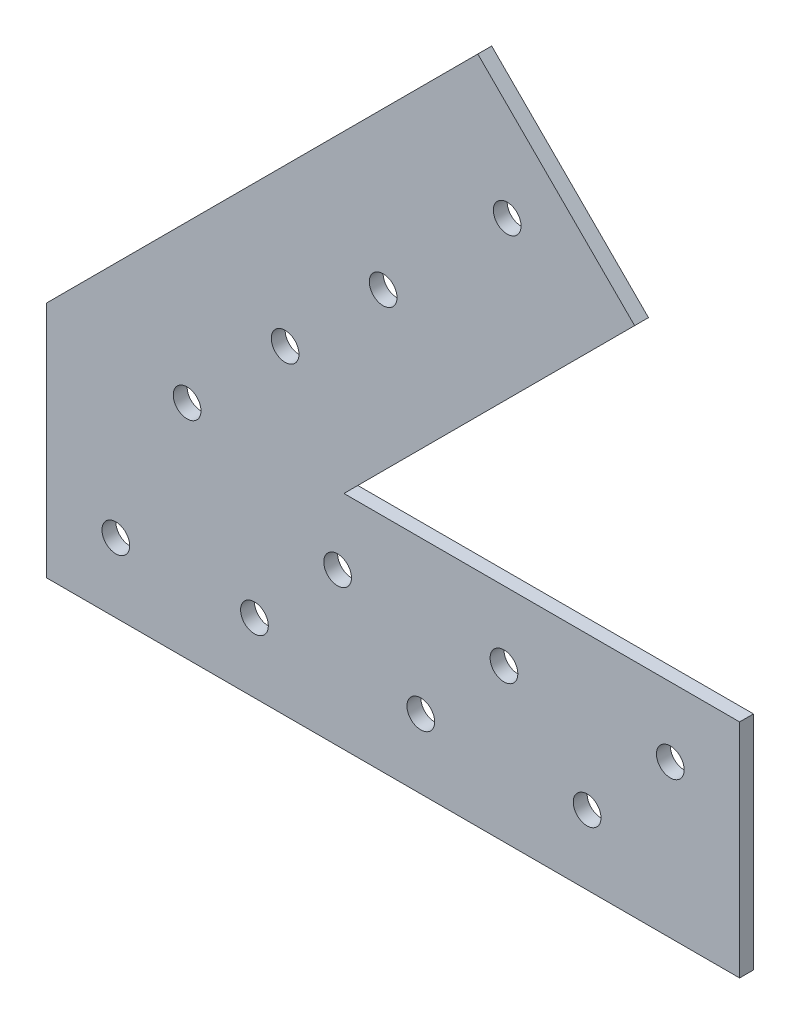
ISO-10303-21;
HEADER;
FILE_DESCRIPTION(('STEP AP214'),'2;1');
FILE_NAME('part.step','',(''),(''),'','','');
FILE_SCHEMA(('AUTOMOTIVE_DESIGN { 1 0 10303 214 1 1 1 1 }'));
ENDSEC;
DATA;
#1=APPLICATION_CONTEXT('core data for automotive mechanical design processes');
#2=APPLICATION_PROTOCOL_DEFINITION('international standard','automotive_design',2000,#1);
#3=PRODUCT_CONTEXT('',#1,'mechanical');
#4=PRODUCT('Part','Part','',(#3));
#5=PRODUCT_RELATED_PRODUCT_CATEGORY('part','',(#4));
#6=PRODUCT_DEFINITION_FORMATION('','',#4);
#7=PRODUCT_DEFINITION_CONTEXT('part definition',#1,'design');
#8=PRODUCT_DEFINITION('design','',#6,#7);
#9=PRODUCT_DEFINITION_SHAPE('','',#8);
#10=(LENGTH_UNIT() NAMED_UNIT(*) SI_UNIT(.MILLI.,.METRE.));
#11=(NAMED_UNIT(*) PLANE_ANGLE_UNIT() SI_UNIT($,.RADIAN.));
#12=(NAMED_UNIT(*) SI_UNIT($,.STERADIAN.) SOLID_ANGLE_UNIT());
#13=UNCERTAINTY_MEASURE_WITH_UNIT(LENGTH_MEASURE(1.E-05),#10,'distance_accuracy_value','');
#14=(GEOMETRIC_REPRESENTATION_CONTEXT(3) GLOBAL_UNCERTAINTY_ASSIGNED_CONTEXT((#13)) GLOBAL_UNIT_ASSIGNED_CONTEXT((#10,
#11,#12)) REPRESENTATION_CONTEXT('',''));
#15=CARTESIAN_POINT('',(0.,0.,0.));
#16=DIRECTION('',(0.,0.,1.));
#17=DIRECTION('',(1.,0.,0.));
#18=AXIS2_PLACEMENT_3D('',#15,#16,#17);
#19=CARTESIAN_POINT('',(260.,10.,5.));
#20=DIRECTION('',(0.,1.,0.));
#21=DIRECTION('',(-1.,0.,0.));
#22=AXIS2_PLACEMENT_3D('',#19,#20,#21);
#23=PLANE('',#22);
#24=DIRECTION('',(1.,0.,0.));
#25=VECTOR('',#24,1.);
#26=CARTESIAN_POINT('',(260.,10.,0.));
#27=LINE('',#26,#25);
#28=CARTESIAN_POINT('',(10.,10.,0.));
#29=VERTEX_POINT('',#28);
#30=CARTESIAN_POINT('',(260.,10.,0.));
#31=VERTEX_POINT('',#30);
#32=EDGE_CURVE('E128',#29,#31,#27,.T.);
#33=ORIENTED_EDGE('',*,*,#32,.T.);
#34=DIRECTION('',(0.,0.,-1.));
#35=VECTOR('',#34,1.);
#36=CARTESIAN_POINT('',(260.,10.,5.));
#37=LINE('',#36,#35);
#38=CARTESIAN_POINT('',(260.,10.,5.));
#39=VERTEX_POINT('',#38);
#40=EDGE_CURVE('E11',#39,#31,#37,.T.);
#41=ORIENTED_EDGE('',*,*,#40,.F.);
#42=DIRECTION('',(1.,0.,0.));
#43=VECTOR('',#42,1.);
#44=CARTESIAN_POINT('',(260.,10.,5.));
#45=LINE('',#44,#43);
#46=CARTESIAN_POINT('',(10.,10.,5.));
#47=VERTEX_POINT('',#46);
#48=EDGE_CURVE('E141',#47,#39,#45,.T.);
#49=ORIENTED_EDGE('',*,*,#48,.F.);
#50=DIRECTION('',(0.,0.,-1.));
#51=VECTOR('',#50,1.);
#52=CARTESIAN_POINT('',(10.,10.,5.));
#53=LINE('',#52,#51);
#54=EDGE_CURVE('E124',#47,#29,#53,.T.);
#55=ORIENTED_EDGE('',*,*,#54,.T.);
#56=EDGE_LOOP('',(#33,#41,#49,#55));
#57=FACE_BOUND('',#56,.T.);
#58=ADVANCED_FACE('F38',(#57),#23,.F.);
#59=CARTESIAN_POINT('',(260.,90.,5.));
#60=DIRECTION('',(-1.,0.,0.));
#61=DIRECTION('',(0.,0.,1.));
#62=AXIS2_PLACEMENT_3D('',#59,#60,#61);
#63=PLANE('',#62);
#64=DIRECTION('',(0.,1.,0.));
#65=VECTOR('',#64,1.);
#66=CARTESIAN_POINT('',(260.,90.,0.));
#67=LINE('',#66,#65);
#68=CARTESIAN_POINT('',(260.,90.,0.));
#69=VERTEX_POINT('',#68);
#70=EDGE_CURVE('E131',#31,#69,#67,.T.);
#71=ORIENTED_EDGE('',*,*,#70,.T.);
#72=DIRECTION('',(0.,0.,-1.));
#73=VECTOR('',#72,1.);
#74=CARTESIAN_POINT('',(260.,90.,5.));
#75=LINE('',#74,#73);
#76=CARTESIAN_POINT('',(260.,90.,5.));
#77=VERTEX_POINT('',#76);
#78=EDGE_CURVE('E46',#77,#69,#75,.T.);
#79=ORIENTED_EDGE('',*,*,#78,.F.);
#80=DIRECTION('',(0.,1.,0.));
#81=VECTOR('',#80,1.);
#82=CARTESIAN_POINT('',(260.,90.,5.));
#83=LINE('',#82,#81);
#84=EDGE_CURVE('E94',#39,#77,#83,.T.);
#85=ORIENTED_EDGE('',*,*,#84,.F.);
#86=ORIENTED_EDGE('',*,*,#40,.T.);
#87=EDGE_LOOP('',(#71,#79,#85,#86));
#88=FACE_BOUND('',#87,.T.);
#89=ADVANCED_FACE('F279',(#88),#63,.F.);
#90=CARTESIAN_POINT('',(117.28,90.,5.));
#91=DIRECTION('',(0.,-1.,0.));
#92=DIRECTION('',(0.,0.,-1.));
#93=AXIS2_PLACEMENT_3D('',#90,#91,#92);
#94=PLANE('',#93);
#95=DIRECTION('',(-1.,0.,0.));
#96=VECTOR('',#95,1.);
#97=CARTESIAN_POINT('',(117.28,90.,0.));
#98=LINE('',#97,#96);
#99=CARTESIAN_POINT('',(117.28,90.,0.));
#100=VERTEX_POINT('',#99);
#101=EDGE_CURVE('E134',#69,#100,#98,.T.);
#102=ORIENTED_EDGE('',*,*,#101,.T.);
#103=DIRECTION('',(0.,0.,-1.));
#104=VECTOR('',#103,1.);
#105=CARTESIAN_POINT('',(117.28,90.,5.));
#106=LINE('',#105,#104);
#107=CARTESIAN_POINT('',(117.28,90.,5.));
#108=VERTEX_POINT('',#107);
#109=EDGE_CURVE('E145',#108,#100,#106,.T.);
#110=ORIENTED_EDGE('',*,*,#109,.F.);
#111=DIRECTION('',(-1.,0.,0.));
#112=VECTOR('',#111,1.);
#113=CARTESIAN_POINT('',(117.28,90.,5.));
#114=LINE('',#113,#112);
#115=EDGE_CURVE('E153',#77,#108,#114,.T.);
#116=ORIENTED_EDGE('',*,*,#115,.F.);
#117=ORIENTED_EDGE('',*,*,#78,.T.);
#118=EDGE_LOOP('',(#102,#110,#116,#117));
#119=FACE_BOUND('',#118,.T.);
#120=ADVANCED_FACE('F151',(#119),#94,.F.);
#121=CARTESIAN_POINT('',(222.132034355965,194.852034355964,5.));
#122=DIRECTION('',(-0.707106781186544,0.707106781186551,0.));
#123=DIRECTION('',(-0.707106781186551,-0.707106781186544,0.));
#124=AXIS2_PLACEMENT_3D('',#121,#122,#123);
#125=PLANE('',#124);
#126=DIRECTION('',(0.707106781186551,0.707106781186544,0.));
#127=VECTOR('',#126,1.);
#128=CARTESIAN_POINT('',(222.132034355965,194.852034355964,0.));
#129=LINE('',#128,#127);
#130=CARTESIAN_POINT('',(222.132034355965,194.852034355964,0.));
#131=VERTEX_POINT('',#130);
#132=EDGE_CURVE('E136',#100,#131,#129,.T.);
#133=ORIENTED_EDGE('',*,*,#132,.T.);
#134=DIRECTION('',(0.,0.,-1.));
#135=VECTOR('',#134,1.);
#136=CARTESIAN_POINT('',(222.132034355965,194.852034355964,5.));
#137=LINE('',#136,#135);
#138=CARTESIAN_POINT('',(222.132034355965,194.852034355964,5.));
#139=VERTEX_POINT('',#138);
#140=EDGE_CURVE('E119',#139,#131,#137,.T.);
#141=ORIENTED_EDGE('',*,*,#140,.F.);
#142=DIRECTION('',(0.707106781186551,0.707106781186544,0.));
#143=VECTOR('',#142,1.);
#144=CARTESIAN_POINT('',(222.132034355965,194.852034355964,5.));
#145=LINE('',#144,#143);
#146=EDGE_CURVE('E110',#108,#139,#145,.T.);
#147=ORIENTED_EDGE('',*,*,#146,.F.);
#148=ORIENTED_EDGE('',*,*,#109,.T.);
#149=EDGE_LOOP('',(#133,#141,#147,#148));
#150=FACE_BOUND('',#149,.T.);
#151=ADVANCED_FACE('F159',(#150),#125,.F.);
#152=CARTESIAN_POINT('',(165.563491861042,251.420576850888,5.));
#153=DIRECTION('',(-0.707106781186551,-0.707106781186544,0.));
#154=DIRECTION('',(0.707106781186544,-0.707106781186551,0.));
#155=AXIS2_PLACEMENT_3D('',#152,#153,#154);
#156=PLANE('',#155);
#157=DIRECTION('',(-0.707106781186544,0.707106781186551,0.));
#158=VECTOR('',#157,1.);
#159=CARTESIAN_POINT('',(165.563491861042,251.420576850888,0.));
#160=LINE('',#159,#158);
#161=CARTESIAN_POINT('',(165.563491861042,251.420576850888,0.));
#162=VERTEX_POINT('',#161);
#163=EDGE_CURVE('E118',#131,#162,#160,.T.);
#164=ORIENTED_EDGE('',*,*,#163,.T.);
#165=DIRECTION('',(0.,0.,-1.));
#166=VECTOR('',#165,1.);
#167=CARTESIAN_POINT('',(165.563491861042,251.420576850888,5.));
#168=LINE('',#167,#166);
#169=CARTESIAN_POINT('',(165.563491861042,251.420576850888,5.));
#170=VERTEX_POINT('',#169);
#171=EDGE_CURVE('E115',#170,#162,#168,.T.);
#172=ORIENTED_EDGE('',*,*,#171,.F.);
#173=DIRECTION('',(-0.707106781186544,0.707106781186551,0.));
#174=VECTOR('',#173,1.);
#175=CARTESIAN_POINT('',(165.563491861042,251.420576850888,5.));
#176=LINE('',#175,#174);
#177=EDGE_CURVE('E104',#139,#170,#176,.T.);
#178=ORIENTED_EDGE('',*,*,#177,.F.);
#179=ORIENTED_EDGE('',*,*,#140,.T.);
#180=EDGE_LOOP('',(#164,#172,#178,#179));
#181=FACE_BOUND('',#180,.T.);
#182=ADVANCED_FACE('F116',(#181),#156,.F.);
#183=CARTESIAN_POINT('',(10.0000000000014,95.8570849898473,5.));
#184=DIRECTION('',(0.707106781186549,-0.707106781186546,0.));
#185=DIRECTION('',(0.707106781186546,0.707106781186549,0.));
#186=AXIS2_PLACEMENT_3D('',#183,#184,#185);
#187=PLANE('',#186);
#188=DIRECTION('',(-0.707106781186546,-0.707106781186549,0.));
#189=VECTOR('',#188,1.);
#190=CARTESIAN_POINT('',(10.0000000000014,95.8570849898473,0.));
#191=LINE('',#190,#189);
#192=CARTESIAN_POINT('',(10.0000000000014,95.8570849898473,0.));
#193=VERTEX_POINT('',#192);
#194=EDGE_CURVE('E80',#162,#193,#191,.T.);
#195=ORIENTED_EDGE('',*,*,#194,.T.);
#196=DIRECTION('',(0.,0.,-1.));
#197=VECTOR('',#196,1.);
#198=CARTESIAN_POINT('',(10.0000000000014,95.8570849898473,5.));
#199=LINE('',#198,#197);
#200=CARTESIAN_POINT('',(10.0000000000014,95.8570849898473,5.));
#201=VERTEX_POINT('',#200);
#202=EDGE_CURVE('E120',#201,#193,#199,.T.);
#203=ORIENTED_EDGE('',*,*,#202,.F.);
#204=DIRECTION('',(-0.707106781186546,-0.707106781186549,0.));
#205=VECTOR('',#204,1.);
#206=CARTESIAN_POINT('',(10.0000000000014,95.8570849898473,5.));
#207=LINE('',#206,#205);
#208=EDGE_CURVE('E108',#170,#201,#207,.T.);
#209=ORIENTED_EDGE('',*,*,#208,.F.);
#210=ORIENTED_EDGE('',*,*,#171,.T.);
#211=EDGE_LOOP('',(#195,#203,#209,#210));
#212=FACE_BOUND('',#211,.T.);
#213=ADVANCED_FACE('F122',(#212),#187,.F.);
#214=CARTESIAN_POINT('',(10.,10.,5.));
#215=DIRECTION('',(1.,0.,0.));
#216=DIRECTION('',(0.,1.,0.));
#217=AXIS2_PLACEMENT_3D('',#214,#215,#216);
#218=PLANE('',#217);
#219=DIRECTION('',(0.,-1.,0.));
#220=VECTOR('',#219,1.);
#221=CARTESIAN_POINT('',(10.,10.,0.));
#222=LINE('',#221,#220);
#223=EDGE_CURVE('E86',#193,#29,#222,.T.);
#224=ORIENTED_EDGE('',*,*,#223,.T.);
#225=ORIENTED_EDGE('',*,*,#54,.F.);
#226=DIRECTION('',(0.,-1.,0.));
#227=VECTOR('',#226,1.);
#228=CARTESIAN_POINT('',(10.,10.,5.));
#229=LINE('',#228,#227);
#230=EDGE_CURVE('E54',#201,#47,#229,.T.);
#231=ORIENTED_EDGE('',*,*,#230,.F.);
#232=ORIENTED_EDGE('',*,*,#202,.T.);
#233=EDGE_LOOP('',(#224,#225,#231,#232));
#234=FACE_BOUND('',#233,.T.);
#235=ADVANCED_FACE('F241',(#234),#218,.F.);
#236=CARTESIAN_POINT('',(0.,0.,5.));
#237=DIRECTION('',(0.,0.,-1.));
#238=DIRECTION('',(-1.,0.,0.));
#239=AXIS2_PLACEMENT_3D('',#236,#237,#238);
#240=PLANE('',#239);
#241=CARTESIAN_POINT('',(85.0000000000014,35.,5.));
#242=DIRECTION('',(0.,0.,1.));
#243=DIRECTION('',(1.,0.,0.));
#244=AXIS2_PLACEMENT_3D('',#241,#242,#243);
#245=CIRCLE('',#244,5.);
#246=CARTESIAN_POINT('',(90.0000000000014,35.,5.));
#247=VERTEX_POINT('',#246);
#248=EDGE_CURVE('E224',#247,#247,#245,.T.);
#249=ORIENTED_EDGE('',*,*,#248,.F.);
#250=EDGE_LOOP('',(#249));
#251=FACE_BOUND('',#250,.T.);
#252=CARTESIAN_POINT('',(115.000000000001,65.,5.));
#253=DIRECTION('',(0.,0.,1.));
#254=DIRECTION('',(1.,0.,0.));
#255=AXIS2_PLACEMENT_3D('',#252,#253,#254);
#256=CIRCLE('',#255,5.);
#257=CARTESIAN_POINT('',(120.000000000001,65.,5.));
#258=VERTEX_POINT('',#257);
#259=EDGE_CURVE('E218',#258,#258,#256,.T.);
#260=ORIENTED_EDGE('',*,*,#259,.F.);
#261=EDGE_LOOP('',(#260));
#262=FACE_BOUND('',#261,.T.);
#263=CARTESIAN_POINT('',(145.000000000001,35.,5.));
#264=DIRECTION('',(0.,0.,1.));
#265=DIRECTION('',(1.,0.,0.));
#266=AXIS2_PLACEMENT_3D('',#263,#264,#265);
#267=CIRCLE('',#266,5.);
#268=CARTESIAN_POINT('',(150.000000000001,35.,5.));
#269=VERTEX_POINT('',#268);
#270=EDGE_CURVE('E212',#269,#269,#267,.T.);
#271=ORIENTED_EDGE('',*,*,#270,.F.);
#272=EDGE_LOOP('',(#271));
#273=FACE_BOUND('',#272,.T.);
#274=CARTESIAN_POINT('',(175.000000000001,65.,5.));
#275=DIRECTION('',(0.,0.,1.));
#276=DIRECTION('',(1.,0.,0.));
#277=AXIS2_PLACEMENT_3D('',#274,#275,#276);
#278=CIRCLE('',#277,5.);
#279=CARTESIAN_POINT('',(180.000000000001,65.,5.));
#280=VERTEX_POINT('',#279);
#281=EDGE_CURVE('E206',#280,#280,#278,.T.);
#282=ORIENTED_EDGE('',*,*,#281,.F.);
#283=EDGE_LOOP('',(#282));
#284=FACE_BOUND('',#283,.T.);
#285=CARTESIAN_POINT('',(205.000000000001,35.,5.));
#286=DIRECTION('',(0.,0.,1.));
#287=DIRECTION('',(1.,0.,0.));
#288=AXIS2_PLACEMENT_3D('',#285,#286,#287);
#289=CIRCLE('',#288,5.);
#290=CARTESIAN_POINT('',(210.000000000001,35.,5.));
#291=VERTEX_POINT('',#290);
#292=EDGE_CURVE('E200',#291,#291,#289,.T.);
#293=ORIENTED_EDGE('',*,*,#292,.F.);
#294=EDGE_LOOP('',(#293));
#295=FACE_BOUND('',#294,.T.);
#296=CARTESIAN_POINT('',(235.000000000001,65.,5.));
#297=DIRECTION('',(0.,0.,1.));
#298=DIRECTION('',(1.,0.,0.));
#299=AXIS2_PLACEMENT_3D('',#296,#297,#298);
#300=CIRCLE('',#299,5.);
#301=CARTESIAN_POINT('',(240.000000000001,65.,5.));
#302=VERTEX_POINT('',#301);
#303=EDGE_CURVE('E194',#302,#302,#300,.T.);
#304=ORIENTED_EDGE('',*,*,#303,.F.);
#305=EDGE_LOOP('',(#304));
#306=FACE_BOUND('',#305,.T.);
#307=CARTESIAN_POINT('',(96.0661233356786,125.355235982676,5.));
#308=DIRECTION('',(0.,0.,1.));
#309=DIRECTION('',(1.,0.,0.));
#310=AXIS2_PLACEMENT_3D('',#307,#308,#309);
#311=CIRCLE('',#310,5.00000000000001);
#312=CARTESIAN_POINT('',(101.066123335679,125.355235982676,5.));
#313=VERTEX_POINT('',#312);
#314=EDGE_CURVE('E189',#313,#313,#311,.T.);
#315=ORIENTED_EDGE('',*,*,#314,.F.);
#316=EDGE_LOOP('',(#315));
#317=FACE_BOUND('',#316,.T.);
#318=CARTESIAN_POINT('',(131.421565471357,160.710471965351,5.));
#319=DIRECTION('',(0.,0.,1.));
#320=DIRECTION('',(1.,0.,0.));
#321=AXIS2_PLACEMENT_3D('',#318,#319,#320);
#322=CIRCLE('',#321,5.00000000000001);
#323=CARTESIAN_POINT('',(136.421565471357,160.710471965351,5.));
#324=VERTEX_POINT('',#323);
#325=EDGE_CURVE('E183',#324,#324,#322,.T.);
#326=ORIENTED_EDGE('',*,*,#325,.F.);
#327=EDGE_LOOP('',(#326));
#328=FACE_BOUND('',#327,.T.);
#329=CARTESIAN_POINT('',(176.170042040664,205.458687612088,5.));
#330=DIRECTION('',(0.,0.,1.));
#331=DIRECTION('',(1.,0.,0.));
#332=AXIS2_PLACEMENT_3D('',#329,#330,#331);
#333=CIRCLE('',#332,5.00000000000001);
#334=CARTESIAN_POINT('',(181.170042040664,205.458687612088,5.));
#335=VERTEX_POINT('',#334);
#336=EDGE_CURVE('E176',#335,#335,#333,.T.);
#337=ORIENTED_EDGE('',*,*,#336,.F.);
#338=EDGE_LOOP('',(#337));
#339=FACE_BOUND('',#338,.T.);
#340=CARTESIAN_POINT('',(35.0000000000014,35.,5.));
#341=DIRECTION('',(0.,0.,1.));
#342=DIRECTION('',(1.,0.,0.));
#343=AXIS2_PLACEMENT_3D('',#340,#341,#342);
#344=CIRCLE('',#343,5.);
#345=CARTESIAN_POINT('',(40.0000000000014,35.,5.));
#346=VERTEX_POINT('',#345);
#347=EDGE_CURVE('E170',#346,#346,#344,.T.);
#348=ORIENTED_EDGE('',*,*,#347,.F.);
#349=EDGE_LOOP('',(#348));
#350=FACE_BOUND('',#349,.T.);
#351=CARTESIAN_POINT('',(60.7106812,90.,5.));
#352=DIRECTION('',(0.,0.,1.));
#353=DIRECTION('',(1.,0.,0.));
#354=AXIS2_PLACEMENT_3D('',#351,#352,#353);
#355=CIRCLE('',#354,5.00000000000001);
#356=CARTESIAN_POINT('',(65.7106812,90.,5.));
#357=VERTEX_POINT('',#356);
#358=EDGE_CURVE('E164',#357,#357,#355,.T.);
#359=ORIENTED_EDGE('',*,*,#358,.F.);
#360=EDGE_LOOP('',(#359));
#361=FACE_BOUND('',#360,.T.);
#362=ORIENTED_EDGE('',*,*,#48,.T.);
#363=ORIENTED_EDGE('',*,*,#84,.T.);
#364=ORIENTED_EDGE('',*,*,#115,.T.);
#365=ORIENTED_EDGE('',*,*,#146,.T.);
#366=ORIENTED_EDGE('',*,*,#177,.T.);
#367=ORIENTED_EDGE('',*,*,#208,.T.);
#368=ORIENTED_EDGE('',*,*,#230,.T.);
#369=EDGE_LOOP('',(#362,#363,#364,#365,#366,#367,#368));
#370=FACE_BOUND('',#369,.T.);
#371=ADVANCED_FACE('F106',(#251,#262,#273,#284,#295,#306,#317,#328,#339,#350,#361,#370),#240,.F.);
#372=CARTESIAN_POINT('',(0.,0.,0.));
#373=DIRECTION('',(0.,0.,-1.));
#374=DIRECTION('',(-1.,0.,0.));
#375=AXIS2_PLACEMENT_3D('',#372,#373,#374);
#376=PLANE('',#375);
#377=CARTESIAN_POINT('',(85.0000000000014,35.,0.));
#378=DIRECTION('',(0.,0.,1.));
#379=DIRECTION('',(1.,0.,0.));
#380=AXIS2_PLACEMENT_3D('',#377,#378,#379);
#381=CIRCLE('',#380,5.);
#382=CARTESIAN_POINT('',(90.0000000000014,35.,0.));
#383=VERTEX_POINT('',#382);
#384=EDGE_CURVE('E180',#383,#383,#381,.T.);
#385=ORIENTED_EDGE('',*,*,#384,.T.);
#386=EDGE_LOOP('',(#385));
#387=FACE_BOUND('',#386,.T.);
#388=CARTESIAN_POINT('',(115.000000000001,65.,0.));
#389=DIRECTION('',(0.,0.,1.));
#390=DIRECTION('',(1.,0.,0.));
#391=AXIS2_PLACEMENT_3D('',#388,#389,#390);
#392=CIRCLE('',#391,5.);
#393=CARTESIAN_POINT('',(120.000000000001,65.,0.));
#394=VERTEX_POINT('',#393);
#395=EDGE_CURVE('E221',#394,#394,#392,.T.);
#396=ORIENTED_EDGE('',*,*,#395,.T.);
#397=EDGE_LOOP('',(#396));
#398=FACE_BOUND('',#397,.T.);
#399=CARTESIAN_POINT('',(145.000000000001,35.,0.));
#400=DIRECTION('',(0.,0.,1.));
#401=DIRECTION('',(1.,0.,0.));
#402=AXIS2_PLACEMENT_3D('',#399,#400,#401);
#403=CIRCLE('',#402,5.);
#404=CARTESIAN_POINT('',(150.000000000001,35.,0.));
#405=VERTEX_POINT('',#404);
#406=EDGE_CURVE('E215',#405,#405,#403,.T.);
#407=ORIENTED_EDGE('',*,*,#406,.T.);
#408=EDGE_LOOP('',(#407));
#409=FACE_BOUND('',#408,.T.);
#410=CARTESIAN_POINT('',(175.000000000001,65.,0.));
#411=DIRECTION('',(0.,0.,1.));
#412=DIRECTION('',(1.,0.,0.));
#413=AXIS2_PLACEMENT_3D('',#410,#411,#412);
#414=CIRCLE('',#413,5.);
#415=CARTESIAN_POINT('',(180.000000000001,65.,0.));
#416=VERTEX_POINT('',#415);
#417=EDGE_CURVE('E209',#416,#416,#414,.T.);
#418=ORIENTED_EDGE('',*,*,#417,.T.);
#419=EDGE_LOOP('',(#418));
#420=FACE_BOUND('',#419,.T.);
#421=CARTESIAN_POINT('',(205.000000000001,35.,0.));
#422=DIRECTION('',(0.,0.,1.));
#423=DIRECTION('',(1.,0.,0.));
#424=AXIS2_PLACEMENT_3D('',#421,#422,#423);
#425=CIRCLE('',#424,5.);
#426=CARTESIAN_POINT('',(210.000000000001,35.,0.));
#427=VERTEX_POINT('',#426);
#428=EDGE_CURVE('E203',#427,#427,#425,.T.);
#429=ORIENTED_EDGE('',*,*,#428,.T.);
#430=EDGE_LOOP('',(#429));
#431=FACE_BOUND('',#430,.T.);
#432=CARTESIAN_POINT('',(235.000000000001,65.,0.));
#433=DIRECTION('',(0.,0.,1.));
#434=DIRECTION('',(1.,0.,0.));
#435=AXIS2_PLACEMENT_3D('',#432,#433,#434);
#436=CIRCLE('',#435,5.);
#437=CARTESIAN_POINT('',(240.000000000001,65.,0.));
#438=VERTEX_POINT('',#437);
#439=EDGE_CURVE('E197',#438,#438,#436,.T.);
#440=ORIENTED_EDGE('',*,*,#439,.T.);
#441=EDGE_LOOP('',(#440));
#442=FACE_BOUND('',#441,.T.);
#443=CARTESIAN_POINT('',(96.0661233356786,125.355235982676,0.));
#444=DIRECTION('',(0.,0.,1.));
#445=DIRECTION('',(1.,0.,0.));
#446=AXIS2_PLACEMENT_3D('',#443,#444,#445);
#447=CIRCLE('',#446,5.00000000000001);
#448=CARTESIAN_POINT('',(101.066123335679,125.355235982676,0.));
#449=VERTEX_POINT('',#448);
#450=EDGE_CURVE('E173',#449,#449,#447,.T.);
#451=ORIENTED_EDGE('',*,*,#450,.T.);
#452=EDGE_LOOP('',(#451));
#453=FACE_BOUND('',#452,.T.);
#454=CARTESIAN_POINT('',(131.421565471357,160.710471965351,0.));
#455=DIRECTION('',(0.,0.,1.));
#456=DIRECTION('',(1.,0.,0.));
#457=AXIS2_PLACEMENT_3D('',#454,#455,#456);
#458=CIRCLE('',#457,5.00000000000001);
#459=CARTESIAN_POINT('',(136.421565471357,160.710471965351,0.));
#460=VERTEX_POINT('',#459);
#461=EDGE_CURVE('E186',#460,#460,#458,.T.);
#462=ORIENTED_EDGE('',*,*,#461,.T.);
#463=EDGE_LOOP('',(#462));
#464=FACE_BOUND('',#463,.T.);
#465=CARTESIAN_POINT('',(176.170042040664,205.458687612088,0.));
#466=DIRECTION('',(0.,0.,1.));
#467=DIRECTION('',(1.,0.,0.));
#468=AXIS2_PLACEMENT_3D('',#465,#466,#467);
#469=CIRCLE('',#468,5.00000000000001);
#470=CARTESIAN_POINT('',(181.170042040664,205.458687612088,0.));
#471=VERTEX_POINT('',#470);
#472=EDGE_CURVE('E179',#471,#471,#469,.T.);
#473=ORIENTED_EDGE('',*,*,#472,.T.);
#474=EDGE_LOOP('',(#473));
#475=FACE_BOUND('',#474,.T.);
#476=CARTESIAN_POINT('',(35.0000000000014,35.,0.));
#477=DIRECTION('',(0.,0.,1.));
#478=DIRECTION('',(1.,0.,0.));
#479=AXIS2_PLACEMENT_3D('',#476,#477,#478);
#480=CIRCLE('',#479,5.);
#481=CARTESIAN_POINT('',(40.0000000000014,35.,0.));
#482=VERTEX_POINT('',#481);
#483=EDGE_CURVE('E167',#482,#482,#480,.T.);
#484=ORIENTED_EDGE('',*,*,#483,.T.);
#485=EDGE_LOOP('',(#484));
#486=FACE_BOUND('',#485,.T.);
#487=CARTESIAN_POINT('',(60.7106812,90.,0.));
#488=DIRECTION('',(0.,0.,1.));
#489=DIRECTION('',(1.,0.,0.));
#490=AXIS2_PLACEMENT_3D('',#487,#488,#489);
#491=CIRCLE('',#490,5.00000000000001);
#492=CARTESIAN_POINT('',(65.7106812,90.,0.));
#493=VERTEX_POINT('',#492);
#494=EDGE_CURVE('E132',#493,#493,#491,.T.);
#495=ORIENTED_EDGE('',*,*,#494,.T.);
#496=EDGE_LOOP('',(#495));
#497=FACE_BOUND('',#496,.T.);
#498=ORIENTED_EDGE('',*,*,#32,.F.);
#499=ORIENTED_EDGE('',*,*,#223,.F.);
#500=ORIENTED_EDGE('',*,*,#194,.F.);
#501=ORIENTED_EDGE('',*,*,#163,.F.);
#502=ORIENTED_EDGE('',*,*,#132,.F.);
#503=ORIENTED_EDGE('',*,*,#101,.F.);
#504=ORIENTED_EDGE('',*,*,#70,.F.);
#505=EDGE_LOOP('',(#498,#499,#500,#501,#502,#503,#504));
#506=FACE_BOUND('',#505,.T.);
#507=ADVANCED_FACE('F157',(#387,#398,#409,#420,#431,#442,#453,#464,#475,#486,#497,#506),#376,.T.);
#508=CARTESIAN_POINT('',(60.7106812,90.,0.));
#509=DIRECTION('',(0.,0.,1.));
#510=DIRECTION('',(1.,0.,0.));
#511=AXIS2_PLACEMENT_3D('',#508,#509,#510);
#512=CYLINDRICAL_SURFACE('',#511,5.00000000000001);
#513=ORIENTED_EDGE('',*,*,#494,.F.);
#514=EDGE_LOOP('',(#513));
#515=FACE_BOUND('',#514,.T.);
#516=ORIENTED_EDGE('',*,*,#358,.T.);
#517=EDGE_LOOP('',(#516));
#518=FACE_BOUND('',#517,.T.);
#519=ADVANCED_FACE('F263',(#515,#518),#512,.F.);
#520=CARTESIAN_POINT('',(35.0000000000014,35.,0.));
#521=DIRECTION('',(0.,0.,1.));
#522=DIRECTION('',(1.,0.,0.));
#523=AXIS2_PLACEMENT_3D('',#520,#521,#522);
#524=CYLINDRICAL_SURFACE('',#523,5.);
#525=ORIENTED_EDGE('',*,*,#483,.F.);
#526=EDGE_LOOP('',(#525));
#527=FACE_BOUND('',#526,.T.);
#528=ORIENTED_EDGE('',*,*,#347,.T.);
#529=EDGE_LOOP('',(#528));
#530=FACE_BOUND('',#529,.T.);
#531=ADVANCED_FACE('F265',(#527,#530),#524,.F.);
#532=CARTESIAN_POINT('',(176.170042040664,205.458687612088,0.));
#533=DIRECTION('',(0.,0.,1.));
#534=DIRECTION('',(1.,0.,0.));
#535=AXIS2_PLACEMENT_3D('',#532,#533,#534);
#536=CYLINDRICAL_SURFACE('',#535,5.00000000000001);
#537=ORIENTED_EDGE('',*,*,#472,.F.);
#538=EDGE_LOOP('',(#537));
#539=FACE_BOUND('',#538,.T.);
#540=ORIENTED_EDGE('',*,*,#336,.T.);
#541=EDGE_LOOP('',(#540));
#542=FACE_BOUND('',#541,.T.);
#543=ADVANCED_FACE('F272',(#539,#542),#536,.F.);
#544=CARTESIAN_POINT('',(131.421565471357,160.710471965351,0.));
#545=DIRECTION('',(0.,0.,1.));
#546=DIRECTION('',(1.,0.,0.));
#547=AXIS2_PLACEMENT_3D('',#544,#545,#546);
#548=CYLINDRICAL_SURFACE('',#547,5.00000000000001);
#549=ORIENTED_EDGE('',*,*,#461,.F.);
#550=EDGE_LOOP('',(#549));
#551=FACE_BOUND('',#550,.T.);
#552=ORIENTED_EDGE('',*,*,#325,.T.);
#553=EDGE_LOOP('',(#552));
#554=FACE_BOUND('',#553,.T.);
#555=ADVANCED_FACE('F341',(#551,#554),#548,.F.);
#556=CARTESIAN_POINT('',(96.0661233356786,125.355235982676,0.));
#557=DIRECTION('',(0.,0.,1.));
#558=DIRECTION('',(1.,0.,0.));
#559=AXIS2_PLACEMENT_3D('',#556,#557,#558);
#560=CYLINDRICAL_SURFACE('',#559,5.00000000000001);
#561=ORIENTED_EDGE('',*,*,#450,.F.);
#562=EDGE_LOOP('',(#561));
#563=FACE_BOUND('',#562,.T.);
#564=ORIENTED_EDGE('',*,*,#314,.T.);
#565=EDGE_LOOP('',(#564));
#566=FACE_BOUND('',#565,.T.);
#567=ADVANCED_FACE('F352',(#563,#566),#560,.F.);
#568=CARTESIAN_POINT('',(235.000000000001,65.,0.));
#569=DIRECTION('',(0.,0.,1.));
#570=DIRECTION('',(1.,0.,0.));
#571=AXIS2_PLACEMENT_3D('',#568,#569,#570);
#572=CYLINDRICAL_SURFACE('',#571,5.);
#573=ORIENTED_EDGE('',*,*,#439,.F.);
#574=EDGE_LOOP('',(#573));
#575=FACE_BOUND('',#574,.T.);
#576=ORIENTED_EDGE('',*,*,#303,.T.);
#577=EDGE_LOOP('',(#576));
#578=FACE_BOUND('',#577,.T.);
#579=ADVANCED_FACE('F362',(#575,#578),#572,.F.);
#580=CARTESIAN_POINT('',(205.000000000001,35.,0.));
#581=DIRECTION('',(0.,0.,1.));
#582=DIRECTION('',(1.,0.,0.));
#583=AXIS2_PLACEMENT_3D('',#580,#581,#582);
#584=CYLINDRICAL_SURFACE('',#583,5.);
#585=ORIENTED_EDGE('',*,*,#428,.F.);
#586=EDGE_LOOP('',(#585));
#587=FACE_BOUND('',#586,.T.);
#588=ORIENTED_EDGE('',*,*,#292,.T.);
#589=EDGE_LOOP('',(#588));
#590=FACE_BOUND('',#589,.T.);
#591=ADVANCED_FACE('F378',(#587,#590),#584,.F.);
#592=CARTESIAN_POINT('',(175.000000000001,65.,0.));
#593=DIRECTION('',(0.,0.,1.));
#594=DIRECTION('',(1.,0.,0.));
#595=AXIS2_PLACEMENT_3D('',#592,#593,#594);
#596=CYLINDRICAL_SURFACE('',#595,5.);
#597=ORIENTED_EDGE('',*,*,#417,.F.);
#598=EDGE_LOOP('',(#597));
#599=FACE_BOUND('',#598,.T.);
#600=ORIENTED_EDGE('',*,*,#281,.T.);
#601=EDGE_LOOP('',(#600));
#602=FACE_BOUND('',#601,.T.);
#603=ADVANCED_FACE('F389',(#599,#602),#596,.F.);
#604=CARTESIAN_POINT('',(145.000000000001,35.,0.));
#605=DIRECTION('',(0.,0.,1.));
#606=DIRECTION('',(1.,0.,0.));
#607=AXIS2_PLACEMENT_3D('',#604,#605,#606);
#608=CYLINDRICAL_SURFACE('',#607,5.);
#609=ORIENTED_EDGE('',*,*,#406,.F.);
#610=EDGE_LOOP('',(#609));
#611=FACE_BOUND('',#610,.T.);
#612=ORIENTED_EDGE('',*,*,#270,.T.);
#613=EDGE_LOOP('',(#612));
#614=FACE_BOUND('',#613,.T.);
#615=ADVANCED_FACE('F400',(#611,#614),#608,.F.);
#616=CARTESIAN_POINT('',(115.000000000001,65.,0.));
#617=DIRECTION('',(0.,0.,1.));
#618=DIRECTION('',(1.,0.,0.));
#619=AXIS2_PLACEMENT_3D('',#616,#617,#618);
#620=CYLINDRICAL_SURFACE('',#619,5.);
#621=ORIENTED_EDGE('',*,*,#395,.F.);
#622=EDGE_LOOP('',(#621));
#623=FACE_BOUND('',#622,.T.);
#624=ORIENTED_EDGE('',*,*,#259,.T.);
#625=EDGE_LOOP('',(#624));
#626=FACE_BOUND('',#625,.T.);
#627=ADVANCED_FACE('F235',(#623,#626),#620,.F.);
#628=CARTESIAN_POINT('',(85.0000000000014,35.,0.));
#629=DIRECTION('',(0.,0.,1.));
#630=DIRECTION('',(1.,0.,0.));
#631=AXIS2_PLACEMENT_3D('',#628,#629,#630);
#632=CYLINDRICAL_SURFACE('',#631,5.);
#633=ORIENTED_EDGE('',*,*,#384,.F.);
#634=EDGE_LOOP('',(#633));
#635=FACE_BOUND('',#634,.T.);
#636=ORIENTED_EDGE('',*,*,#248,.T.);
#637=EDGE_LOOP('',(#636));
#638=FACE_BOUND('',#637,.T.);
#639=ADVANCED_FACE('F232',(#635,#638),#632,.F.);
#640=CLOSED_SHELL('',(#58,#89,#120,#151,#182,#213,#235,#371,#507,#519,#531,#543,#555,#567,#579,
#591,#603,#615,#627,#639));
#641=MANIFOLD_SOLID_BREP('B2',#640);
#642=ADVANCED_BREP_SHAPE_REPRESENTATION('',(#18,#641),#14);
#643=SHAPE_DEFINITION_REPRESENTATION(#9,#642);
ENDSEC;
END-ISO-10303-21;
